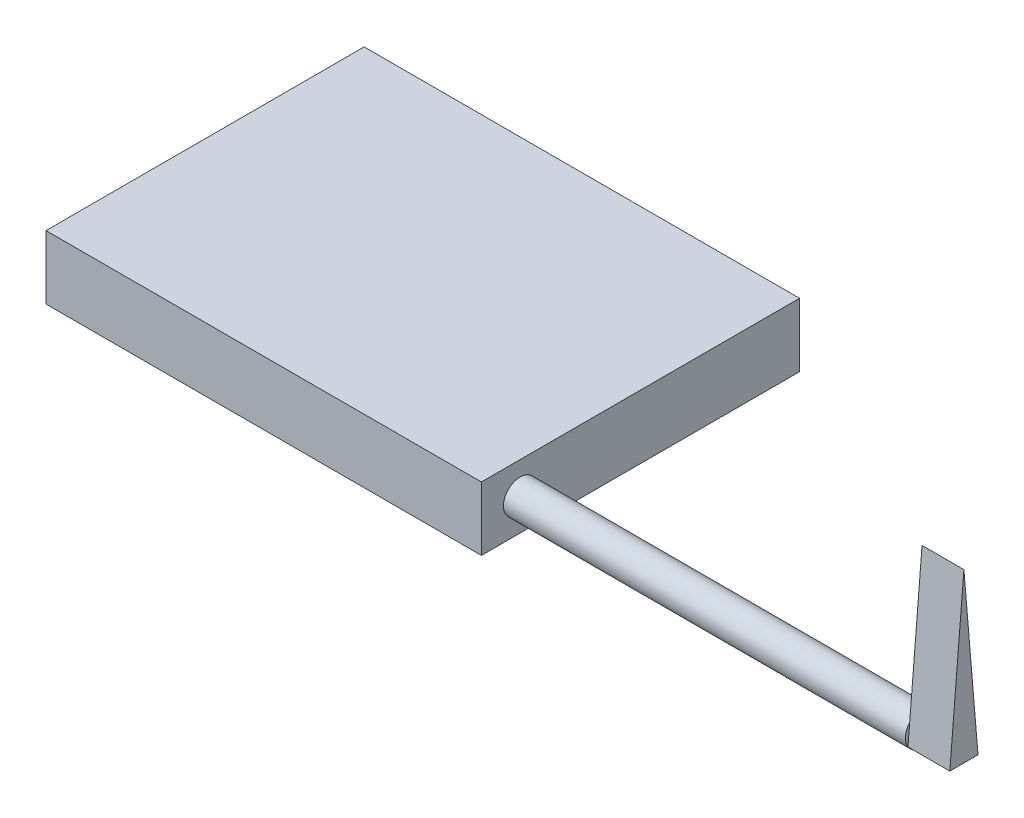
ISO-10303-21;
HEADER;
FILE_DESCRIPTION(('STEP AP214'),'2;1');
FILE_NAME('part.step','',(''),(''),'','','');
FILE_SCHEMA(('AUTOMOTIVE_DESIGN { 1 0 10303 214 1 1 1 1 }'));
ENDSEC;
DATA;
#1=APPLICATION_CONTEXT('core data for automotive mechanical design processes');
#2=APPLICATION_PROTOCOL_DEFINITION('international standard','automotive_design',2000,#1);
#3=PRODUCT_CONTEXT('',#1,'mechanical');
#4=PRODUCT('Part','Part','',(#3));
#5=PRODUCT_RELATED_PRODUCT_CATEGORY('part','',(#4));
#6=PRODUCT_DEFINITION_FORMATION('','',#4);
#7=PRODUCT_DEFINITION_CONTEXT('part definition',#1,'design');
#8=PRODUCT_DEFINITION('design','',#6,#7);
#9=PRODUCT_DEFINITION_SHAPE('','',#8);
#10=(LENGTH_UNIT() NAMED_UNIT(*) SI_UNIT(.MILLI.,.METRE.));
#11=(NAMED_UNIT(*) PLANE_ANGLE_UNIT() SI_UNIT($,.RADIAN.));
#12=(NAMED_UNIT(*) SI_UNIT($,.STERADIAN.) SOLID_ANGLE_UNIT());
#13=UNCERTAINTY_MEASURE_WITH_UNIT(LENGTH_MEASURE(1.E-05),#10,'distance_accuracy_value','');
#14=(GEOMETRIC_REPRESENTATION_CONTEXT(3) GLOBAL_UNCERTAINTY_ASSIGNED_CONTEXT((#13)) GLOBAL_UNIT_ASSIGNED_CONTEXT((#10,
#11,#12)) REPRESENTATION_CONTEXT('',''));
#15=CARTESIAN_POINT('',(0.,0.,0.));
#16=DIRECTION('',(0.,0.,1.));
#17=DIRECTION('',(1.,0.,0.));
#18=AXIS2_PLACEMENT_3D('',#15,#16,#17);
#19=CARTESIAN_POINT('',(59.2188804634915,3.8,14.3682374614876));
#20=DIRECTION('',(1.,0.,0.));
#21=DIRECTION('',(0.,0.,-1.));
#22=AXIS2_PLACEMENT_3D('',#19,#20,#21);
#23=PLANE('',#22);
#24=DIRECTION('',(0.,-0.996480759005681,0.0838218165602545));
#25=VECTOR('',#24,1.);
#26=CARTESIAN_POINT('',(59.2188804634915,22.7184848173732,14.3682374614876));
#27=LINE('',#26,#25);
#28=CARTESIAN_POINT('',(59.2188804634915,5.14736139887323,15.8462825422704));
#29=VERTEX_POINT('',#28);
#30=CARTESIAN_POINT('',(59.2188804634915,2.71848481737324,16.0505944122408));
#31=VERTEX_POINT('',#30);
#32=EDGE_CURVE('E11',#29,#31,#27,.T.);
#33=ORIENTED_EDGE('',*,*,#32,.F.);
#34=CARTESIAN_POINT('',(59.2188804634915,3.8,14.3682374614876));
#35=DIRECTION('',(1.,0.,0.));
#36=DIRECTION('',(0.,0.,-1.));
#37=AXIS2_PLACEMENT_3D('',#34,#35,#36);
#38=CIRCLE('',#37,2.);
#39=EDGE_CURVE('E149',#29,#31,#38,.T.);
#40=ORIENTED_EDGE('',*,*,#39,.T.);
#41=EDGE_LOOP('',(#33,#40));
#42=FACE_BOUND('',#41,.T.);
#43=ADVANCED_FACE('F44',(#42),#23,.T.);
#44=DIRECTION('',(0.,0.996480759005681,0.0838218165602545));
#45=VECTOR('',#44,1.);
#46=CARTESIAN_POINT('',(59.2188804634915,2.71848481737324,12.6858805107343));
#47=LINE('',#46,#45);
#48=CARTESIAN_POINT('',(59.2188804634915,2.71848481737324,12.6858805107343));
#49=VERTEX_POINT('',#48);
#50=CARTESIAN_POINT('',(59.2188804634915,5.14736139887323,12.8901923807047));
#51=VERTEX_POINT('',#50);
#52=EDGE_CURVE('E130',#49,#51,#47,.T.);
#53=ORIENTED_EDGE('',*,*,#52,.F.);
#54=EDGE_CURVE('E135',#49,#51,#38,.T.);
#55=ORIENTED_EDGE('',*,*,#54,.T.);
#56=EDGE_LOOP('',(#53,#55));
#57=FACE_BOUND('',#56,.T.);
#58=ADVANCED_FACE('F222',(#57),#23,.T.);
#59=CARTESIAN_POINT('',(-40.7811195365085,7.6,-19.));
#60=DIRECTION('',(1.,0.,0.));
#61=DIRECTION('',(0.,0.,-1.));
#62=AXIS2_PLACEMENT_3D('',#59,#60,#61);
#63=PLANE('',#62);
#64=DIRECTION('',(0.,0.,1.));
#65=VECTOR('',#64,1.);
#66=CARTESIAN_POINT('',(-40.7811195365085,0.,-19.));
#67=LINE('',#66,#65);
#68=CARTESIAN_POINT('',(-40.7811195365085,0.,-19.));
#69=VERTEX_POINT('',#68);
#70=CARTESIAN_POINT('',(-40.7811195365085,0.,19.));
#71=VERTEX_POINT('',#70);
#72=EDGE_CURVE('E148',#69,#71,#67,.T.);
#73=ORIENTED_EDGE('',*,*,#72,.T.);
#74=DIRECTION('',(0.,-1.,0.));
#75=VECTOR('',#74,1.);
#76=CARTESIAN_POINT('',(-40.7811195365085,7.6,19.));
#77=LINE('',#76,#75);
#78=CARTESIAN_POINT('',(-40.7811195365085,7.6,19.));
#79=VERTEX_POINT('',#78);
#80=EDGE_CURVE('E186',#79,#71,#77,.T.);
#81=ORIENTED_EDGE('',*,*,#80,.F.);
#82=DIRECTION('',(0.,0.,1.));
#83=VECTOR('',#82,1.);
#84=CARTESIAN_POINT('',(-40.7811195365085,7.6,-19.));
#85=LINE('',#84,#83);
#86=CARTESIAN_POINT('',(-40.7811195365085,7.6,-19.));
#87=VERTEX_POINT('',#86);
#88=EDGE_CURVE('E150',#87,#79,#85,.T.);
#89=ORIENTED_EDGE('',*,*,#88,.F.);
#90=DIRECTION('',(0.,-1.,0.));
#91=VECTOR('',#90,1.);
#92=CARTESIAN_POINT('',(-40.7811195365085,7.6,-19.));
#93=LINE('',#92,#91);
#94=EDGE_CURVE('E164',#87,#69,#93,.T.);
#95=ORIENTED_EDGE('',*,*,#94,.T.);
#96=EDGE_LOOP('',(#73,#81,#89,#95));
#97=FACE_BOUND('',#96,.T.);
#98=ADVANCED_FACE('F46',(#97),#63,.F.);
#99=CARTESIAN_POINT('',(-40.7811195365085,7.6,19.));
#100=DIRECTION('',(0.,0.,-1.));
#101=DIRECTION('',(-1.,0.,0.));
#102=AXIS2_PLACEMENT_3D('',#99,#100,#101);
#103=PLANE('',#102);
#104=DIRECTION('',(1.,0.,0.));
#105=VECTOR('',#104,1.);
#106=CARTESIAN_POINT('',(-40.7811195365085,0.,19.));
#107=LINE('',#106,#105);
#108=CARTESIAN_POINT('',(11.2188804634915,0.,19.));
#109=VERTEX_POINT('',#108);
#110=EDGE_CURVE('E168',#71,#109,#107,.T.);
#111=ORIENTED_EDGE('',*,*,#110,.T.);
#112=DIRECTION('',(0.,-1.,0.));
#113=VECTOR('',#112,1.);
#114=CARTESIAN_POINT('',(11.2188804634915,7.6,19.));
#115=LINE('',#114,#113);
#116=CARTESIAN_POINT('',(11.2188804634915,7.6,19.));
#117=VERTEX_POINT('',#116);
#118=EDGE_CURVE('E183',#117,#109,#115,.T.);
#119=ORIENTED_EDGE('',*,*,#118,.F.);
#120=DIRECTION('',(1.,0.,0.));
#121=VECTOR('',#120,1.);
#122=CARTESIAN_POINT('',(-40.7811195365085,7.6,19.));
#123=LINE('',#122,#121);
#124=EDGE_CURVE('E154',#79,#117,#123,.T.);
#125=ORIENTED_EDGE('',*,*,#124,.F.);
#126=ORIENTED_EDGE('',*,*,#80,.T.);
#127=EDGE_LOOP('',(#111,#119,#125,#126));
#128=FACE_BOUND('',#127,.T.);
#129=ADVANCED_FACE('F201',(#128),#103,.F.);
#130=CARTESIAN_POINT('',(11.2188804634915,7.6,-19.));
#131=DIRECTION('',(-1.,0.,0.));
#132=DIRECTION('',(0.,0.,1.));
#133=AXIS2_PLACEMENT_3D('',#130,#131,#132);
#134=PLANE('',#133);
#135=CARTESIAN_POINT('',(11.2188804634915,3.8,14.3682374614876));
#136=DIRECTION('',(-1.,0.,0.));
#137=DIRECTION('',(0.,0.,1.));
#138=AXIS2_PLACEMENT_3D('',#135,#136,#137);
#139=CIRCLE('',#138,2.);
#140=CARTESIAN_POINT('',(11.2188804634915,3.8,16.3682374614876));
#141=VERTEX_POINT('',#140);
#142=EDGE_CURVE('E48',#141,#141,#139,.F.);
#143=ORIENTED_EDGE('',*,*,#142,.F.);
#144=EDGE_LOOP('',(#143));
#145=FACE_BOUND('',#144,.T.);
#146=DIRECTION('',(0.,0.,-1.));
#147=VECTOR('',#146,1.);
#148=CARTESIAN_POINT('',(11.2188804634915,0.,-19.));
#149=LINE('',#148,#147);
#150=CARTESIAN_POINT('',(11.2188804634915,0.,-19.));
#151=VERTEX_POINT('',#150);
#152=EDGE_CURVE('E171',#109,#151,#149,.T.);
#153=ORIENTED_EDGE('',*,*,#152,.T.);
#154=DIRECTION('',(0.,-1.,0.));
#155=VECTOR('',#154,1.);
#156=CARTESIAN_POINT('',(11.2188804634915,7.6,-19.));
#157=LINE('',#156,#155);
#158=CARTESIAN_POINT('',(11.2188804634915,7.6,-19.));
#159=VERTEX_POINT('',#158);
#160=EDGE_CURVE('E179',#159,#151,#157,.T.);
#161=ORIENTED_EDGE('',*,*,#160,.F.);
#162=DIRECTION('',(0.,0.,-1.));
#163=VECTOR('',#162,1.);
#164=CARTESIAN_POINT('',(11.2188804634915,7.6,-19.));
#165=LINE('',#164,#163);
#166=EDGE_CURVE('E158',#117,#159,#165,.T.);
#167=ORIENTED_EDGE('',*,*,#166,.F.);
#168=ORIENTED_EDGE('',*,*,#118,.T.);
#169=EDGE_LOOP('',(#153,#161,#167,#168));
#170=FACE_BOUND('',#169,.T.);
#171=ADVANCED_FACE('F197',(#145,#170),#134,.F.);
#172=CARTESIAN_POINT('',(-40.7811195365085,7.6,-19.));
#173=DIRECTION('',(0.,0.,1.));
#174=DIRECTION('',(1.,0.,0.));
#175=AXIS2_PLACEMENT_3D('',#172,#173,#174);
#176=PLANE('',#175);
#177=DIRECTION('',(-1.,0.,0.));
#178=VECTOR('',#177,1.);
#179=CARTESIAN_POINT('',(-40.7811195365085,0.,-19.));
#180=LINE('',#179,#178);
#181=EDGE_CURVE('E155',#151,#69,#180,.T.);
#182=ORIENTED_EDGE('',*,*,#181,.T.);
#183=ORIENTED_EDGE('',*,*,#94,.F.);
#184=DIRECTION('',(-1.,0.,0.));
#185=VECTOR('',#184,1.);
#186=CARTESIAN_POINT('',(-40.7811195365085,7.6,-19.));
#187=LINE('',#186,#185);
#188=EDGE_CURVE('E161',#159,#87,#187,.T.);
#189=ORIENTED_EDGE('',*,*,#188,.F.);
#190=ORIENTED_EDGE('',*,*,#160,.T.);
#191=EDGE_LOOP('',(#182,#183,#189,#190));
#192=FACE_BOUND('',#191,.T.);
#193=ADVANCED_FACE('F200',(#192),#176,.F.);
#194=CARTESIAN_POINT('',(0.,7.6,0.));
#195=DIRECTION('',(0.,1.,0.));
#196=DIRECTION('',(0.,0.,1.));
#197=AXIS2_PLACEMENT_3D('',#194,#195,#196);
#198=PLANE('',#197);
#199=ORIENTED_EDGE('',*,*,#88,.T.);
#200=ORIENTED_EDGE('',*,*,#124,.T.);
#201=ORIENTED_EDGE('',*,*,#166,.T.);
#202=ORIENTED_EDGE('',*,*,#188,.T.);
#203=EDGE_LOOP('',(#199,#200,#201,#202));
#204=FACE_BOUND('',#203,.T.);
#205=ADVANCED_FACE('F217',(#204),#198,.T.);
#206=CARTESIAN_POINT('',(0.,0.,0.));
#207=DIRECTION('',(0.,1.,0.));
#208=DIRECTION('',(0.,0.,1.));
#209=AXIS2_PLACEMENT_3D('',#206,#207,#208);
#210=PLANE('',#209);
#211=ORIENTED_EDGE('',*,*,#72,.F.);
#212=ORIENTED_EDGE('',*,*,#181,.F.);
#213=ORIENTED_EDGE('',*,*,#152,.F.);
#214=ORIENTED_EDGE('',*,*,#110,.F.);
#215=EDGE_LOOP('',(#211,#212,#213,#214));
#216=FACE_BOUND('',#215,.T.);
#217=ADVANCED_FACE('F213',(#216),#210,.F.);
#218=CARTESIAN_POINT('',(59.2188804634915,3.8,14.3682374614876));
#219=DIRECTION('',(-1.,0.,0.));
#220=DIRECTION('',(0.,0.,1.));
#221=AXIS2_PLACEMENT_3D('',#218,#219,#220);
#222=CYLINDRICAL_SURFACE('',#221,2.);
#223=EDGE_CURVE('E141',#51,#29,#38,.T.);
#224=ORIENTED_EDGE('',*,*,#223,.F.);
#225=ORIENTED_EDGE('',*,*,#54,.F.);
#226=EDGE_CURVE('E139',#31,#49,#38,.T.);
#227=ORIENTED_EDGE('',*,*,#226,.F.);
#228=ORIENTED_EDGE('',*,*,#39,.F.);
#229=EDGE_LOOP('',(#224,#225,#227,#228));
#230=FACE_BOUND('',#229,.T.);
#231=ORIENTED_EDGE('',*,*,#142,.T.);
#232=EDGE_LOOP('',(#231));
#233=FACE_BOUND('',#232,.T.);
#234=ADVANCED_FACE('F195',(#230,#233),#222,.T.);
#235=DIRECTION('',(0.,0.,-1.));
#236=VECTOR('',#235,1.);
#237=CARTESIAN_POINT('',(59.2188804634915,2.71848481737324,16.0505944122408));
#238=LINE('',#237,#236);
#239=EDGE_CURVE('E61',#31,#49,#238,.T.);
#240=ORIENTED_EDGE('',*,*,#239,.F.);
#241=ORIENTED_EDGE('',*,*,#226,.T.);
#242=EDGE_LOOP('',(#240,#241));
#243=FACE_BOUND('',#242,.T.);
#244=ADVANCED_FACE('F225',(#243),#23,.T.);
#245=CARTESIAN_POINT('',(59.2188804634915,0.,0.));
#246=DIRECTION('',(1.,0.,0.));
#247=DIRECTION('',(0.,0.,-1.));
#248=AXIS2_PLACEMENT_3D('',#245,#246,#247);
#249=PLANE('',#248);
#250=CARTESIAN_POINT('',(59.2188804634915,22.7184848173732,14.3682374614876));
#251=VERTEX_POINT('',#250);
#252=EDGE_CURVE('E404',#51,#251,#47,.T.);
#253=ORIENTED_EDGE('',*,*,#252,.F.);
#254=ORIENTED_EDGE('',*,*,#223,.T.);
#255=EDGE_CURVE('E55',#251,#29,#27,.T.);
#256=ORIENTED_EDGE('',*,*,#255,.F.);
#257=EDGE_LOOP('',(#253,#254,#256));
#258=FACE_BOUND('',#257,.T.);
#259=ADVANCED_FACE('F233',(#258),#249,.F.);
#260=CARTESIAN_POINT('',(64.2188804634915,22.7184848173732,14.3682374614876));
#261=DIRECTION('',(0.,-0.0838218165602546,-0.996480759005681));
#262=DIRECTION('',(0.,0.996480759005682,-0.0838218165602546));
#263=AXIS2_PLACEMENT_3D('',#260,#261,#262);
#264=PLANE('',#263);
#265=ORIENTED_EDGE('',*,*,#255,.T.);
#266=ORIENTED_EDGE('',*,*,#32,.T.);
#267=DIRECTION('',(-1.,0.,0.));
#268=VECTOR('',#267,1.);
#269=CARTESIAN_POINT('',(64.2188804634915,2.71848481737324,16.0505944122408));
#270=LINE('',#269,#268);
#271=CARTESIAN_POINT('',(64.2188804634915,2.71848481737324,16.0505944122408));
#272=VERTEX_POINT('',#271);
#273=EDGE_CURVE('E115',#272,#31,#270,.T.);
#274=ORIENTED_EDGE('',*,*,#273,.F.);
#275=DIRECTION('',(0.,-0.996480759005681,0.0838218165602545));
#276=VECTOR('',#275,1.);
#277=CARTESIAN_POINT('',(64.2188804634915,22.7184848173732,14.3682374614876));
#278=LINE('',#277,#276);
#279=CARTESIAN_POINT('',(64.2188804634915,22.7184848173732,14.3682374614876));
#280=VERTEX_POINT('',#279);
#281=EDGE_CURVE('E122',#280,#272,#278,.T.);
#282=ORIENTED_EDGE('',*,*,#281,.F.);
#283=DIRECTION('',(-1.,0.,0.));
#284=VECTOR('',#283,1.);
#285=CARTESIAN_POINT('',(64.2188804634915,22.7184848173732,14.3682374614876));
#286=LINE('',#285,#284);
#287=EDGE_CURVE('E142',#280,#251,#286,.T.);
#288=ORIENTED_EDGE('',*,*,#287,.T.);
#289=EDGE_LOOP('',(#265,#266,#274,#282,#288));
#290=FACE_BOUND('',#289,.T.);
#291=ADVANCED_FACE('F133',(#290),#264,.F.);
#292=CARTESIAN_POINT('',(64.2188804634915,2.71848481737324,16.0505944122408));
#293=DIRECTION('',(0.,1.,0.));
#294=DIRECTION('',(0.,0.,1.));
#295=AXIS2_PLACEMENT_3D('',#292,#293,#294);
#296=PLANE('',#295);
#297=ORIENTED_EDGE('',*,*,#239,.T.);
#298=DIRECTION('',(-1.,0.,0.));
#299=VECTOR('',#298,1.);
#300=CARTESIAN_POINT('',(64.2188804634915,2.71848481737324,12.6858805107343));
#301=LINE('',#300,#299);
#302=CARTESIAN_POINT('',(64.2188804634915,2.71848481737324,12.6858805107343));
#303=VERTEX_POINT('',#302);
#304=EDGE_CURVE('E117',#303,#49,#301,.T.);
#305=ORIENTED_EDGE('',*,*,#304,.F.);
#306=DIRECTION('',(0.,0.,-1.));
#307=VECTOR('',#306,1.);
#308=CARTESIAN_POINT('',(64.2188804634915,2.71848481737324,16.0505944122408));
#309=LINE('',#308,#307);
#310=EDGE_CURVE('E111',#272,#303,#309,.T.);
#311=ORIENTED_EDGE('',*,*,#310,.F.);
#312=ORIENTED_EDGE('',*,*,#273,.T.);
#313=EDGE_LOOP('',(#297,#305,#311,#312));
#314=FACE_BOUND('',#313,.T.);
#315=ADVANCED_FACE('F113',(#314),#296,.F.);
#316=CARTESIAN_POINT('',(64.2188804634915,2.71848481737324,12.6858805107343));
#317=DIRECTION('',(0.,-0.0838218165602546,0.996480759005681));
#318=DIRECTION('',(0.,-0.996480759005682,-0.0838218165602546));
#319=AXIS2_PLACEMENT_3D('',#316,#317,#318);
#320=PLANE('',#319);
#321=ORIENTED_EDGE('',*,*,#52,.T.);
#322=ORIENTED_EDGE('',*,*,#252,.T.);
#323=ORIENTED_EDGE('',*,*,#287,.F.);
#324=DIRECTION('',(0.,0.996480759005681,0.0838218165602545));
#325=VECTOR('',#324,1.);
#326=CARTESIAN_POINT('',(64.2188804634915,2.71848481737324,12.6858805107343));
#327=LINE('',#326,#325);
#328=EDGE_CURVE('E121',#303,#280,#327,.T.);
#329=ORIENTED_EDGE('',*,*,#328,.F.);
#330=ORIENTED_EDGE('',*,*,#304,.T.);
#331=EDGE_LOOP('',(#321,#322,#323,#329,#330));
#332=FACE_BOUND('',#331,.T.);
#333=ADVANCED_FACE('F294',(#332),#320,.F.);
#334=CARTESIAN_POINT('',(64.2188804634915,0.,0.));
#335=DIRECTION('',(1.,0.,0.));
#336=DIRECTION('',(0.,0.,-1.));
#337=AXIS2_PLACEMENT_3D('',#334,#335,#336);
#338=PLANE('',#337);
#339=ORIENTED_EDGE('',*,*,#281,.T.);
#340=ORIENTED_EDGE('',*,*,#310,.T.);
#341=ORIENTED_EDGE('',*,*,#328,.T.);
#342=EDGE_LOOP('',(#339,#340,#341));
#343=FACE_BOUND('',#342,.T.);
#344=ADVANCED_FACE('F125',(#343),#338,.T.);
#345=CLOSED_SHELL('',(#43,#58,#98,#129,#171,#193,#205,#217,#234,#244,#259,#291,#315,#333,#344));
#346=MANIFOLD_SOLID_BREP('B2',#345);
#347=ADVANCED_BREP_SHAPE_REPRESENTATION('',(#18,#346),#14);
#348=SHAPE_DEFINITION_REPRESENTATION(#9,#347);
ENDSEC;
END-ISO-10303-21;
